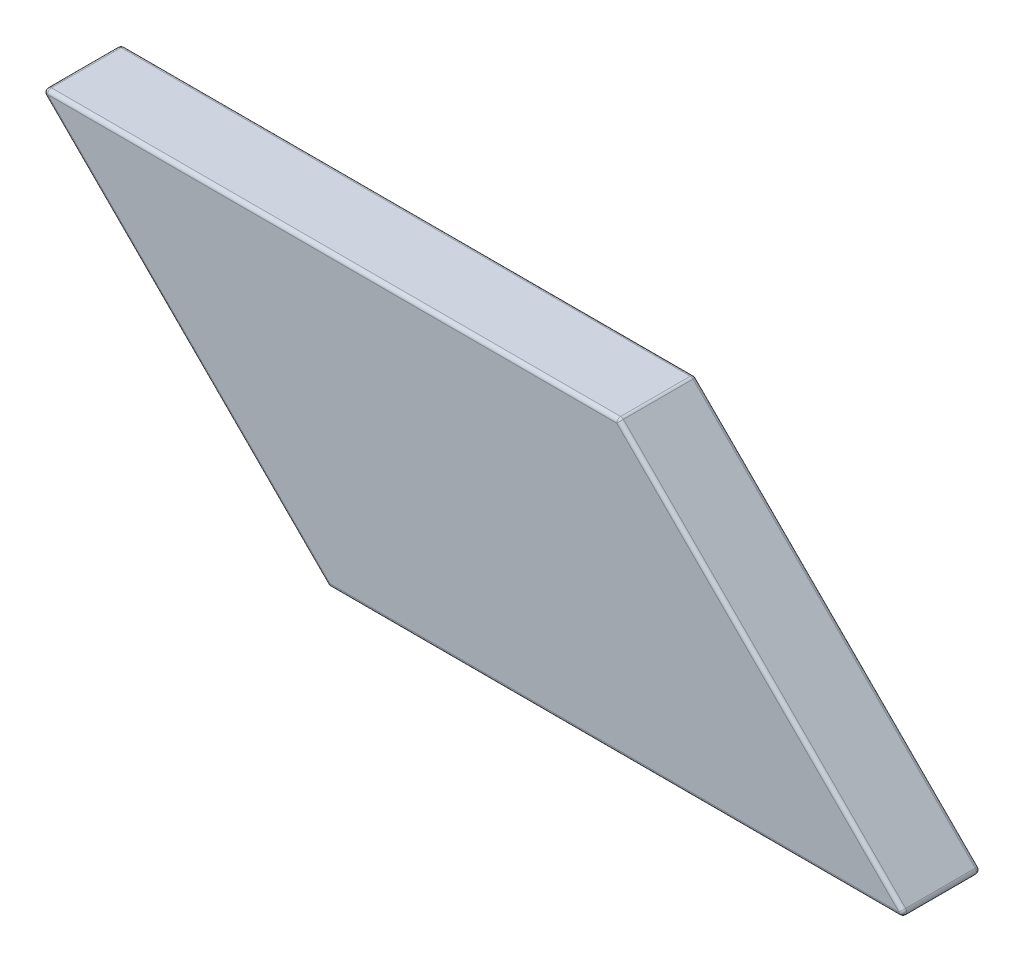
ISO-10303-21;
HEADER;
FILE_DESCRIPTION(('STEP AP214'),'2;1');
FILE_NAME('part.step','',(''),(''),'','','');
FILE_SCHEMA(('AUTOMOTIVE_DESIGN { 1 0 10303 214 1 1 1 1 }'));
ENDSEC;
DATA;
#1=APPLICATION_CONTEXT('core data for automotive mechanical design processes');
#2=APPLICATION_PROTOCOL_DEFINITION('international standard','automotive_design',2000,#1);
#3=PRODUCT_CONTEXT('',#1,'mechanical');
#4=PRODUCT('Part','Part','',(#3));
#5=PRODUCT_RELATED_PRODUCT_CATEGORY('part','',(#4));
#6=PRODUCT_DEFINITION_FORMATION('','',#4);
#7=PRODUCT_DEFINITION_CONTEXT('part definition',#1,'design');
#8=PRODUCT_DEFINITION('design','',#6,#7);
#9=PRODUCT_DEFINITION_SHAPE('','',#8);
#10=(LENGTH_UNIT() NAMED_UNIT(*) SI_UNIT(.MILLI.,.METRE.));
#11=(NAMED_UNIT(*) PLANE_ANGLE_UNIT() SI_UNIT($,.RADIAN.));
#12=(NAMED_UNIT(*) SI_UNIT($,.STERADIAN.) SOLID_ANGLE_UNIT());
#13=UNCERTAINTY_MEASURE_WITH_UNIT(LENGTH_MEASURE(1.E-05),#10,'distance_accuracy_value','');
#14=(GEOMETRIC_REPRESENTATION_CONTEXT(3) GLOBAL_UNCERTAINTY_ASSIGNED_CONTEXT((#13)) GLOBAL_UNIT_ASSIGNED_CONTEXT((#10,
#11,#12)) REPRESENTATION_CONTEXT('',''));
#15=CARTESIAN_POINT('',(0.,0.,0.));
#16=DIRECTION('',(0.,0.,1.));
#17=DIRECTION('',(1.,0.,0.));
#18=AXIS2_PLACEMENT_3D('',#15,#16,#17);
#19=CARTESIAN_POINT('',(0.,0.,10.));
#20=DIRECTION('',(0.,1.,0.));
#21=DIRECTION('',(0.,0.,1.));
#22=AXIS2_PLACEMENT_3D('',#19,#20,#21);
#23=PLANE('',#22);
#24=DIRECTION('',(1.,0.,0.));
#25=VECTOR('',#24,1.);
#26=CARTESIAN_POINT('',(0.,0.,9.5));
#27=LINE('',#26,#25);
#28=CARTESIAN_POINT('',(73.7928932188134,0.,9.5));
#29=VERTEX_POINT('',#28);
#30=CARTESIAN_POINT('',(0.207106781186547,0.,9.5));
#31=VERTEX_POINT('',#30);
#32=EDGE_CURVE('E178',#29,#31,#27,.F.);
#33=ORIENTED_EDGE('',*,*,#32,.T.);
#34=DIRECTION('',(0.,0.,-1.));
#35=VECTOR('',#34,1.);
#36=CARTESIAN_POINT('',(0.207106781186547,0.,10.));
#37=LINE('',#36,#35);
#38=CARTESIAN_POINT('',(0.207106781186547,0.,0.5));
#39=VERTEX_POINT('',#38);
#40=EDGE_CURVE('E182',#31,#39,#37,.T.);
#41=ORIENTED_EDGE('',*,*,#40,.T.);
#42=DIRECTION('',(1.,0.,0.));
#43=VECTOR('',#42,1.);
#44=CARTESIAN_POINT('',(75.,0.,0.5));
#45=LINE('',#44,#43);
#46=CARTESIAN_POINT('',(73.7928932188134,0.,0.5));
#47=VERTEX_POINT('',#46);
#48=EDGE_CURVE('E180',#39,#47,#45,.T.);
#49=ORIENTED_EDGE('',*,*,#48,.T.);
#50=DIRECTION('',(0.,0.,-1.));
#51=VECTOR('',#50,1.);
#52=CARTESIAN_POINT('',(73.7928932188134,0.,10.));
#53=LINE('',#52,#51);
#54=EDGE_CURVE('E176',#47,#29,#53,.F.);
#55=ORIENTED_EDGE('',*,*,#54,.T.);
#56=EDGE_LOOP('',(#33,#41,#49,#55));
#57=FACE_BOUND('',#56,.T.);
#58=ADVANCED_FACE('F33',(#57),#23,.F.);
#59=CARTESIAN_POINT('',(37.5,37.5,10.));
#60=DIRECTION('',(-0.707106781186547,-0.707106781186548,0.));
#61=DIRECTION('',(0.707106781186548,-0.707106781186547,0.));
#62=AXIS2_PLACEMENT_3D('',#59,#60,#61);
#63=PLANE('',#62);
#64=DIRECTION('',(-0.707106781186548,0.707106781186547,0.));
#65=VECTOR('',#64,1.);
#66=CARTESIAN_POINT('',(37.5,37.5,0.5));
#67=LINE('',#66,#65);
#68=CARTESIAN_POINT('',(74.1464466094067,0.853553390593271,0.5));
#69=VERTEX_POINT('',#68);
#70=CARTESIAN_POINT('',(37.6464466094067,37.3535533905933,0.5));
#71=VERTEX_POINT('',#70);
#72=EDGE_CURVE('E189',#69,#71,#67,.T.);
#73=ORIENTED_EDGE('',*,*,#72,.T.);
#74=DIRECTION('',(0.,0.,-1.));
#75=VECTOR('',#74,1.);
#76=CARTESIAN_POINT('',(37.6464466094067,37.3535533905933,10.));
#77=LINE('',#76,#75);
#78=CARTESIAN_POINT('',(37.6464466094067,37.3535533905933,9.5));
#79=VERTEX_POINT('',#78);
#80=EDGE_CURVE('E192',#71,#79,#77,.F.);
#81=ORIENTED_EDGE('',*,*,#80,.T.);
#82=DIRECTION('',(-0.707106781186548,0.707106781186547,0.));
#83=VECTOR('',#82,1.);
#84=CARTESIAN_POINT('',(37.5,37.5,9.5));
#85=LINE('',#84,#83);
#86=CARTESIAN_POINT('',(74.1464466094067,0.853553390593271,9.5));
#87=VERTEX_POINT('',#86);
#88=EDGE_CURVE('E187',#79,#87,#85,.F.);
#89=ORIENTED_EDGE('',*,*,#88,.T.);
#90=DIRECTION('',(0.,0.,-1.));
#91=VECTOR('',#90,1.);
#92=CARTESIAN_POINT('',(74.1464466094067,0.853553390593273,10.));
#93=LINE('',#92,#91);
#94=EDGE_CURVE('E185',#87,#69,#93,.T.);
#95=ORIENTED_EDGE('',*,*,#94,.T.);
#96=EDGE_LOOP('',(#73,#81,#89,#95));
#97=FACE_BOUND('',#96,.T.);
#98=ADVANCED_FACE('F278',(#97),#63,.F.);
#99=CARTESIAN_POINT('',(-37.5,37.5,10.));
#100=DIRECTION('',(0.,-1.,0.));
#101=DIRECTION('',(0.,0.,-1.));
#102=AXIS2_PLACEMENT_3D('',#99,#100,#101);
#103=PLANE('',#102);
#104=DIRECTION('',(-1.,0.,0.));
#105=VECTOR('',#104,1.);
#106=CARTESIAN_POINT('',(-37.5,37.5,0.5));
#107=LINE('',#106,#105);
#108=CARTESIAN_POINT('',(37.2928932188134,37.5,0.5));
#109=VERTEX_POINT('',#108);
#110=CARTESIAN_POINT('',(-36.2928932188135,37.5,0.5));
#111=VERTEX_POINT('',#110);
#112=EDGE_CURVE('E198',#109,#111,#107,.T.);
#113=ORIENTED_EDGE('',*,*,#112,.T.);
#114=DIRECTION('',(0.,0.,-1.));
#115=VECTOR('',#114,1.);
#116=CARTESIAN_POINT('',(-36.2928932188135,37.5,10.));
#117=LINE('',#116,#115);
#118=CARTESIAN_POINT('',(-36.2928932188135,37.5,9.5));
#119=VERTEX_POINT('',#118);
#120=EDGE_CURVE('E201',#111,#119,#117,.F.);
#121=ORIENTED_EDGE('',*,*,#120,.T.);
#122=DIRECTION('',(-1.,0.,0.));
#123=VECTOR('',#122,1.);
#124=CARTESIAN_POINT('',(-37.5,37.5,9.5));
#125=LINE('',#124,#123);
#126=CARTESIAN_POINT('',(37.2928932188134,37.5,9.5));
#127=VERTEX_POINT('',#126);
#128=EDGE_CURVE('E196',#119,#127,#125,.F.);
#129=ORIENTED_EDGE('',*,*,#128,.T.);
#130=DIRECTION('',(0.,0.,-1.));
#131=VECTOR('',#130,1.);
#132=CARTESIAN_POINT('',(37.2928932188134,37.5,10.));
#133=LINE('',#132,#131);
#134=EDGE_CURVE('E194',#127,#109,#133,.T.);
#135=ORIENTED_EDGE('',*,*,#134,.T.);
#136=EDGE_LOOP('',(#113,#121,#129,#135));
#137=FACE_BOUND('',#136,.T.);
#138=ADVANCED_FACE('F300',(#137),#103,.F.);
#139=CARTESIAN_POINT('',(0.,0.,10.));
#140=DIRECTION('',(0.707106781186547,0.707106781186548,0.));
#141=DIRECTION('',(-0.707106781186548,0.707106781186547,0.));
#142=AXIS2_PLACEMENT_3D('',#139,#140,#141);
#143=PLANE('',#142);
#144=DIRECTION('',(0.,0.,-1.));
#145=VECTOR('',#144,1.);
#146=CARTESIAN_POINT('',(-36.6464466094067,36.6464466094067,10.));
#147=LINE('',#146,#145);
#148=CARTESIAN_POINT('',(-36.6464466094067,36.6464466094067,9.5));
#149=VERTEX_POINT('',#148);
#150=CARTESIAN_POINT('',(-36.6464466094067,36.6464466094067,0.5));
#151=VERTEX_POINT('',#150);
#152=EDGE_CURVE('E129',#149,#151,#147,.T.);
#153=ORIENTED_EDGE('',*,*,#152,.T.);
#154=DIRECTION('',(0.707106781186548,-0.707106781186547,0.));
#155=VECTOR('',#154,1.);
#156=CARTESIAN_POINT('',(0.,0.,0.5));
#157=LINE('',#156,#155);
#158=CARTESIAN_POINT('',(-0.146446609406726,0.146446609406726,0.5));
#159=VERTEX_POINT('',#158);
#160=EDGE_CURVE('E165',#151,#159,#157,.T.);
#161=ORIENTED_EDGE('',*,*,#160,.T.);
#162=DIRECTION('',(0.,0.,-1.));
#163=VECTOR('',#162,1.);
#164=CARTESIAN_POINT('',(-0.146446609406726,0.146446609406726,10.));
#165=LINE('',#164,#163);
#166=CARTESIAN_POINT('',(-0.146446609406726,0.146446609406726,9.5));
#167=VERTEX_POINT('',#166);
#168=EDGE_CURVE('E132',#159,#167,#165,.F.);
#169=ORIENTED_EDGE('',*,*,#168,.T.);
#170=DIRECTION('',(0.707106781186548,-0.707106781186547,0.));
#171=VECTOR('',#170,1.);
#172=CARTESIAN_POINT('',(0.,0.,9.5));
#173=LINE('',#172,#171);
#174=EDGE_CURVE('E124',#167,#149,#173,.F.);
#175=ORIENTED_EDGE('',*,*,#174,.T.);
#176=EDGE_LOOP('',(#153,#161,#169,#175));
#177=FACE_BOUND('',#176,.T.);
#178=ADVANCED_FACE('F126',(#177),#143,.F.);
#179=CARTESIAN_POINT('',(0.,0.,10.));
#180=DIRECTION('',(0.,0.,-1.));
#181=DIRECTION('',(-1.,0.,0.));
#182=AXIS2_PLACEMENT_3D('',#179,#180,#181);
#183=PLANE('',#182);
#184=DIRECTION('',(0.707106781186548,-0.707106781186547,0.));
#185=VECTOR('',#184,1.);
#186=CARTESIAN_POINT('',(0.353553390593274,0.353553390593274,10.));
#187=LINE('',#186,#185);
#188=CARTESIAN_POINT('',(-36.2928932188135,37.,10.));
#189=VERTEX_POINT('',#188);
#190=CARTESIAN_POINT('',(0.207106781186547,0.5,10.));
#191=VERTEX_POINT('',#190);
#192=EDGE_CURVE('E142',#189,#191,#187,.T.);
#193=ORIENTED_EDGE('',*,*,#192,.T.);
#194=DIRECTION('',(1.,0.,0.));
#195=VECTOR('',#194,1.);
#196=CARTESIAN_POINT('',(0.,0.5,10.));
#197=LINE('',#196,#195);
#198=CARTESIAN_POINT('',(73.7928932188134,0.5,10.));
#199=VERTEX_POINT('',#198);
#200=EDGE_CURVE('E11',#191,#199,#197,.T.);
#201=ORIENTED_EDGE('',*,*,#200,.T.);
#202=DIRECTION('',(-0.707106781186548,0.707106781186547,0.));
#203=VECTOR('',#202,1.);
#204=CARTESIAN_POINT('',(37.1464466094067,37.1464466094067,10.));
#205=LINE('',#204,#203);
#206=CARTESIAN_POINT('',(37.2928932188134,37.,10.));
#207=VERTEX_POINT('',#206);
#208=EDGE_CURVE('E42',#199,#207,#205,.T.);
#209=ORIENTED_EDGE('',*,*,#208,.T.);
#210=DIRECTION('',(-1.,0.,0.));
#211=VECTOR('',#210,1.);
#212=CARTESIAN_POINT('',(0.,37.,10.));
#213=LINE('',#212,#211);
#214=EDGE_CURVE('E204',#207,#189,#213,.T.);
#215=ORIENTED_EDGE('',*,*,#214,.T.);
#216=EDGE_LOOP('',(#193,#201,#209,#215));
#217=FACE_BOUND('',#216,.T.);
#218=ADVANCED_FACE('F260',(#217),#183,.F.);
#219=CARTESIAN_POINT('',(0.,0.,0.));
#220=DIRECTION('',(0.,0.,-1.));
#221=DIRECTION('',(-1.,0.,0.));
#222=AXIS2_PLACEMENT_3D('',#219,#220,#221);
#223=PLANE('',#222);
#224=DIRECTION('',(1.,0.,0.));
#225=VECTOR('',#224,1.);
#226=CARTESIAN_POINT('',(0.,0.5,0.));
#227=LINE('',#226,#225);
#228=CARTESIAN_POINT('',(73.7928932188134,0.5,0.));
#229=VERTEX_POINT('',#228);
#230=CARTESIAN_POINT('',(0.207106781186552,0.5,0.));
#231=VERTEX_POINT('',#230);
#232=EDGE_CURVE('E171',#229,#231,#227,.F.);
#233=ORIENTED_EDGE('',*,*,#232,.T.);
#234=DIRECTION('',(0.707106781186548,-0.707106781186547,0.));
#235=VECTOR('',#234,1.);
#236=CARTESIAN_POINT('',(-37.1464466094067,37.8535533905933,0.));
#237=LINE('',#236,#235);
#238=CARTESIAN_POINT('',(-36.2928932188135,37.,0.));
#239=VERTEX_POINT('',#238);
#240=EDGE_CURVE('E173',#231,#239,#237,.F.);
#241=ORIENTED_EDGE('',*,*,#240,.T.);
#242=DIRECTION('',(-1.,0.,0.));
#243=VECTOR('',#242,1.);
#244=CARTESIAN_POINT('',(37.5,37.,0.));
#245=LINE('',#244,#243);
#246=CARTESIAN_POINT('',(37.2928932188134,37.,0.));
#247=VERTEX_POINT('',#246);
#248=EDGE_CURVE('E167',#239,#247,#245,.F.);
#249=ORIENTED_EDGE('',*,*,#248,.T.);
#250=DIRECTION('',(-0.707106781186548,0.707106781186547,0.));
#251=VECTOR('',#250,1.);
#252=CARTESIAN_POINT('',(74.6464466094067,-0.353553390593273,0.));
#253=LINE('',#252,#251);
#254=EDGE_CURVE('E169',#247,#229,#253,.F.);
#255=ORIENTED_EDGE('',*,*,#254,.T.);
#256=EDGE_LOOP('',(#233,#241,#249,#255));
#257=FACE_BOUND('',#256,.T.);
#258=ADVANCED_FACE('F475',(#257),#223,.T.);
#259=CARTESIAN_POINT('',(37.1464466094067,37.1464466094067,9.5));
#260=DIRECTION('',(-0.707106781186548,0.707106781186547,0.));
#261=DIRECTION('',(-0.707106781186547,-0.707106781186548,0.));
#262=AXIS2_PLACEMENT_3D('',#259,#260,#261);
#263=CYLINDRICAL_SURFACE('',#262,0.5);
#264=CARTESIAN_POINT('',(37.2928932188134,37.,9.5));
#265=DIRECTION('',(-0.707106781186547,0.707106781186547,0.));
#266=DIRECTION('',(-0.707106781186548,-0.707106781186548,0.));
#267=AXIS2_PLACEMENT_3D('',#264,#265,#266);
#268=CIRCLE('',#267,0.5);
#269=EDGE_CURVE('E37',#207,#79,#268,.T.);
#270=ORIENTED_EDGE('',*,*,#269,.F.);
#271=ORIENTED_EDGE('',*,*,#208,.F.);
#272=CARTESIAN_POINT('',(73.7928932188134,0.499999999999997,9.5));
#273=DIRECTION('',(0.707106781186549,-0.707106781186546,0.));
#274=DIRECTION('',(0.707106781186546,0.707106781186549,0.));
#275=AXIS2_PLACEMENT_3D('',#272,#273,#274);
#276=CIRCLE('',#275,0.5);
#277=EDGE_CURVE('E162',#87,#199,#276,.T.);
#278=ORIENTED_EDGE('',*,*,#277,.F.);
#279=ORIENTED_EDGE('',*,*,#88,.F.);
#280=EDGE_LOOP('',(#270,#271,#278,#279));
#281=FACE_BOUND('',#280,.T.);
#282=ADVANCED_FACE('F35',(#281),#263,.T.);
#283=CARTESIAN_POINT('',(37.2928932188134,37.,9.5));
#284=DIRECTION('',(0.,0.,1.));
#285=DIRECTION('',(1.,0.,0.));
#286=AXIS2_PLACEMENT_3D('',#283,#284,#285);
#287=SPHERICAL_SURFACE('',#286,0.5);
#288=CARTESIAN_POINT('',(37.2928932188134,37.,9.5));
#289=DIRECTION('',(1.,0.,0.));
#290=DIRECTION('',(0.,0.,-1.));
#291=AXIS2_PLACEMENT_3D('',#288,#289,#290);
#292=CIRCLE('',#291,0.5);
#293=EDGE_CURVE('E247',#207,#127,#292,.F.);
#294=ORIENTED_EDGE('',*,*,#293,.F.);
#295=ORIENTED_EDGE('',*,*,#269,.T.);
#296=CARTESIAN_POINT('',(37.2928932188134,37.,9.5));
#297=DIRECTION('',(0.,0.,1.));
#298=DIRECTION('',(1.,0.,0.));
#299=AXIS2_PLACEMENT_3D('',#296,#297,#298);
#300=CIRCLE('',#299,0.5);
#301=EDGE_CURVE('E250',#127,#79,#300,.F.);
#302=ORIENTED_EDGE('',*,*,#301,.F.);
#303=EDGE_LOOP('',(#294,#295,#302));
#304=FACE_BOUND('',#303,.T.);
#305=ADVANCED_FACE('F294',(#304),#287,.T.);
#306=CARTESIAN_POINT('',(73.7928932188134,0.5,9.5));
#307=DIRECTION('',(0.,0.,1.));
#308=DIRECTION('',(1.,0.,0.));
#309=AXIS2_PLACEMENT_3D('',#306,#307,#308);
#310=SPHERICAL_SURFACE('',#309,0.5);
#311=CARTESIAN_POINT('',(73.7928932188134,0.5,9.5));
#312=DIRECTION('',(0.,0.,1.));
#313=DIRECTION('',(1.,0.,0.));
#314=AXIS2_PLACEMENT_3D('',#311,#312,#313);
#315=CIRCLE('',#314,0.5);
#316=EDGE_CURVE('E243',#87,#29,#315,.F.);
#317=ORIENTED_EDGE('',*,*,#316,.F.);
#318=ORIENTED_EDGE('',*,*,#277,.T.);
#319=CARTESIAN_POINT('',(73.7928932188134,0.5,9.5));
#320=DIRECTION('',(1.,0.,0.));
#321=DIRECTION('',(0.,0.,-1.));
#322=AXIS2_PLACEMENT_3D('',#319,#320,#321);
#323=CIRCLE('',#322,0.5);
#324=EDGE_CURVE('E50',#29,#199,#323,.F.);
#325=ORIENTED_EDGE('',*,*,#324,.F.);
#326=EDGE_LOOP('',(#317,#318,#325));
#327=FACE_BOUND('',#326,.T.);
#328=ADVANCED_FACE('F255',(#327),#310,.T.);
#329=CARTESIAN_POINT('',(37.2928932188134,37.,10.));
#330=DIRECTION('',(0.,0.,-1.));
#331=DIRECTION('',(-1.,0.,0.));
#332=AXIS2_PLACEMENT_3D('',#329,#330,#331);
#333=CYLINDRICAL_SURFACE('',#332,0.5);
#334=ORIENTED_EDGE('',*,*,#301,.T.);
#335=ORIENTED_EDGE('',*,*,#80,.F.);
#336=CARTESIAN_POINT('',(37.2928932188134,37.,0.5));
#337=DIRECTION('',(0.,0.,-1.));
#338=DIRECTION('',(-1.,0.,0.));
#339=AXIS2_PLACEMENT_3D('',#336,#337,#338);
#340=CIRCLE('',#339,0.5);
#341=EDGE_CURVE('E238',#109,#71,#340,.T.);
#342=ORIENTED_EDGE('',*,*,#341,.F.);
#343=ORIENTED_EDGE('',*,*,#134,.F.);
#344=EDGE_LOOP('',(#334,#335,#342,#343));
#345=FACE_BOUND('',#344,.T.);
#346=ADVANCED_FACE('F290',(#345),#333,.T.);
#347=CARTESIAN_POINT('',(0.,37.,9.5));
#348=DIRECTION('',(-1.,0.,0.));
#349=DIRECTION('',(0.,0.,1.));
#350=AXIS2_PLACEMENT_3D('',#347,#348,#349);
#351=CYLINDRICAL_SURFACE('',#350,0.5);
#352=ORIENTED_EDGE('',*,*,#293,.T.);
#353=ORIENTED_EDGE('',*,*,#128,.F.);
#354=CARTESIAN_POINT('',(-36.2928932188135,37.,9.5));
#355=DIRECTION('',(-1.,0.,0.));
#356=DIRECTION('',(0.,0.,1.));
#357=AXIS2_PLACEMENT_3D('',#354,#355,#356);
#358=CIRCLE('',#357,0.5);
#359=EDGE_CURVE('E146',#189,#119,#358,.T.);
#360=ORIENTED_EDGE('',*,*,#359,.F.);
#361=ORIENTED_EDGE('',*,*,#214,.F.);
#362=EDGE_LOOP('',(#352,#353,#360,#361));
#363=FACE_BOUND('',#362,.T.);
#364=ADVANCED_FACE('F298',(#363),#351,.T.);
#365=CARTESIAN_POINT('',(0.353553390593274,0.353553390593274,9.5));
#366=DIRECTION('',(0.707106781186548,-0.707106781186547,0.));
#367=DIRECTION('',(0.707106781186547,0.707106781186548,0.));
#368=AXIS2_PLACEMENT_3D('',#365,#366,#367);
#369=CYLINDRICAL_SURFACE('',#368,0.5);
#370=CARTESIAN_POINT('',(0.207106781186547,0.5,9.5));
#371=DIRECTION('',(0.707106781186548,-0.707106781186547,0.));
#372=DIRECTION('',(0.707106781186547,0.707106781186548,0.));
#373=AXIS2_PLACEMENT_3D('',#370,#371,#372);
#374=CIRCLE('',#373,0.5);
#375=EDGE_CURVE('E147',#191,#167,#374,.T.);
#376=ORIENTED_EDGE('',*,*,#375,.F.);
#377=ORIENTED_EDGE('',*,*,#192,.F.);
#378=CARTESIAN_POINT('',(-36.2928932188135,37.,9.5));
#379=DIRECTION('',(-0.707106781186547,0.707106781186547,0.));
#380=DIRECTION('',(-0.707106781186548,-0.707106781186548,0.));
#381=AXIS2_PLACEMENT_3D('',#378,#379,#380);
#382=CIRCLE('',#381,0.5);
#383=EDGE_CURVE('E139',#149,#189,#382,.T.);
#384=ORIENTED_EDGE('',*,*,#383,.F.);
#385=ORIENTED_EDGE('',*,*,#174,.F.);
#386=EDGE_LOOP('',(#376,#377,#384,#385));
#387=FACE_BOUND('',#386,.T.);
#388=ADVANCED_FACE('F141',(#387),#369,.T.);
#389=CARTESIAN_POINT('',(0.,0.5,9.5));
#390=DIRECTION('',(1.,0.,0.));
#391=DIRECTION('',(0.,0.,-1.));
#392=AXIS2_PLACEMENT_3D('',#389,#390,#391);
#393=CYLINDRICAL_SURFACE('',#392,0.5);
#394=ORIENTED_EDGE('',*,*,#324,.T.);
#395=ORIENTED_EDGE('',*,*,#200,.F.);
#396=CARTESIAN_POINT('',(0.207106781186547,0.5,9.5));
#397=DIRECTION('',(-1.,0.,0.));
#398=DIRECTION('',(0.,0.,1.));
#399=AXIS2_PLACEMENT_3D('',#396,#397,#398);
#400=CIRCLE('',#399,0.5);
#401=EDGE_CURVE('E233',#31,#191,#400,.T.);
#402=ORIENTED_EDGE('',*,*,#401,.F.);
#403=ORIENTED_EDGE('',*,*,#32,.F.);
#404=EDGE_LOOP('',(#394,#395,#402,#403));
#405=FACE_BOUND('',#404,.T.);
#406=ADVANCED_FACE('F262',(#405),#393,.T.);
#407=CARTESIAN_POINT('',(73.7928932188134,0.5,10.));
#408=DIRECTION('',(0.,0.,-1.));
#409=DIRECTION('',(-1.,0.,0.));
#410=AXIS2_PLACEMENT_3D('',#407,#408,#409);
#411=CYLINDRICAL_SURFACE('',#410,0.5);
#412=ORIENTED_EDGE('',*,*,#316,.T.);
#413=ORIENTED_EDGE('',*,*,#54,.F.);
#414=CARTESIAN_POINT('',(73.7928932188134,0.499999999999997,0.5));
#415=DIRECTION('',(0.,0.,-1.));
#416=DIRECTION('',(-1.,0.,0.));
#417=AXIS2_PLACEMENT_3D('',#414,#415,#416);
#418=CIRCLE('',#417,0.5);
#419=EDGE_CURVE('E230',#69,#47,#418,.T.);
#420=ORIENTED_EDGE('',*,*,#419,.F.);
#421=ORIENTED_EDGE('',*,*,#94,.F.);
#422=EDGE_LOOP('',(#412,#413,#420,#421));
#423=FACE_BOUND('',#422,.T.);
#424=ADVANCED_FACE('F275',(#423),#411,.T.);
#425=CARTESIAN_POINT('',(37.1464466094067,37.1464466094067,0.5));
#426=DIRECTION('',(0.707106781186548,-0.707106781186547,0.));
#427=DIRECTION('',(0.707106781186547,0.707106781186548,0.));
#428=AXIS2_PLACEMENT_3D('',#425,#426,#427);
#429=CYLINDRICAL_SURFACE('',#428,0.5);
#430=CARTESIAN_POINT('',(37.2928932188134,37.,0.5));
#431=DIRECTION('',(-0.707106781186547,0.707106781186547,0.));
#432=DIRECTION('',(-0.707106781186548,-0.707106781186548,0.));
#433=AXIS2_PLACEMENT_3D('',#430,#431,#432);
#434=CIRCLE('',#433,0.5);
#435=EDGE_CURVE('E240',#71,#247,#434,.T.);
#436=ORIENTED_EDGE('',*,*,#435,.F.);
#437=ORIENTED_EDGE('',*,*,#72,.F.);
#438=CARTESIAN_POINT('',(73.7928932188134,0.5,0.5));
#439=DIRECTION('',(0.707106781186546,-0.707106781186549,0.));
#440=DIRECTION('',(0.707106781186549,0.707106781186546,0.));
#441=AXIS2_PLACEMENT_3D('',#438,#439,#440);
#442=CIRCLE('',#441,0.5);
#443=EDGE_CURVE('E227',#229,#69,#442,.T.);
#444=ORIENTED_EDGE('',*,*,#443,.F.);
#445=ORIENTED_EDGE('',*,*,#254,.F.);
#446=EDGE_LOOP('',(#436,#437,#444,#445));
#447=FACE_BOUND('',#446,.T.);
#448=ADVANCED_FACE('F282',(#447),#429,.T.);
#449=CARTESIAN_POINT('',(37.2928932188134,37.,0.5));
#450=DIRECTION('',(0.,0.,1.));
#451=DIRECTION('',(1.,0.,0.));
#452=AXIS2_PLACEMENT_3D('',#449,#450,#451);
#453=SPHERICAL_SURFACE('',#452,0.5);
#454=ORIENTED_EDGE('',*,*,#341,.T.);
#455=ORIENTED_EDGE('',*,*,#435,.T.);
#456=CARTESIAN_POINT('',(37.2928932188134,37.,0.5));
#457=DIRECTION('',(1.,0.,0.));
#458=DIRECTION('',(0.,0.,-1.));
#459=AXIS2_PLACEMENT_3D('',#456,#457,#458);
#460=CIRCLE('',#459,0.5);
#461=EDGE_CURVE('E154',#109,#247,#460,.F.);
#462=ORIENTED_EDGE('',*,*,#461,.F.);
#463=EDGE_LOOP('',(#454,#455,#462));
#464=FACE_BOUND('',#463,.T.);
#465=ADVANCED_FACE('F405',(#464),#453,.T.);
#466=CARTESIAN_POINT('',(-36.2928932188135,37.,9.5));
#467=DIRECTION('',(0.,0.,1.));
#468=DIRECTION('',(1.,0.,0.));
#469=AXIS2_PLACEMENT_3D('',#466,#467,#468);
#470=SPHERICAL_SURFACE('',#469,0.5);
#471=ORIENTED_EDGE('',*,*,#383,.T.);
#472=ORIENTED_EDGE('',*,*,#359,.T.);
#473=CARTESIAN_POINT('',(-36.2928932188135,37.,9.5));
#474=DIRECTION('',(0.,0.,1.));
#475=DIRECTION('',(1.,0.,0.));
#476=AXIS2_PLACEMENT_3D('',#473,#474,#475);
#477=CIRCLE('',#476,0.5);
#478=EDGE_CURVE('E150',#149,#119,#477,.F.);
#479=ORIENTED_EDGE('',*,*,#478,.F.);
#480=EDGE_LOOP('',(#471,#472,#479));
#481=FACE_BOUND('',#480,.T.);
#482=ADVANCED_FACE('F151',(#481),#470,.T.);
#483=CARTESIAN_POINT('',(0.207106781186547,0.5,9.5));
#484=DIRECTION('',(0.,0.,1.));
#485=DIRECTION('',(1.,0.,0.));
#486=AXIS2_PLACEMENT_3D('',#483,#484,#485);
#487=SPHERICAL_SURFACE('',#486,0.5);
#488=ORIENTED_EDGE('',*,*,#401,.T.);
#489=ORIENTED_EDGE('',*,*,#375,.T.);
#490=CARTESIAN_POINT('',(0.207106781186547,0.5,9.5));
#491=DIRECTION('',(0.,0.,1.));
#492=DIRECTION('',(1.,0.,0.));
#493=AXIS2_PLACEMENT_3D('',#490,#491,#492);
#494=CIRCLE('',#493,0.5);
#495=EDGE_CURVE('E155',#31,#167,#494,.F.);
#496=ORIENTED_EDGE('',*,*,#495,.F.);
#497=EDGE_LOOP('',(#488,#489,#496));
#498=FACE_BOUND('',#497,.T.);
#499=ADVANCED_FACE('F265',(#498),#487,.T.);
#500=CARTESIAN_POINT('',(73.7928932188134,0.5,0.5));
#501=DIRECTION('',(0.,0.,1.));
#502=DIRECTION('',(1.,0.,0.));
#503=AXIS2_PLACEMENT_3D('',#500,#501,#502);
#504=SPHERICAL_SURFACE('',#503,0.5);
#505=ORIENTED_EDGE('',*,*,#443,.T.);
#506=ORIENTED_EDGE('',*,*,#419,.T.);
#507=CARTESIAN_POINT('',(73.7928932188134,0.5,0.5));
#508=DIRECTION('',(1.,0.,0.));
#509=DIRECTION('',(0.,0.,-1.));
#510=AXIS2_PLACEMENT_3D('',#507,#508,#509);
#511=CIRCLE('',#510,0.5);
#512=EDGE_CURVE('E220',#229,#47,#511,.F.);
#513=ORIENTED_EDGE('',*,*,#512,.F.);
#514=EDGE_LOOP('',(#505,#506,#513));
#515=FACE_BOUND('',#514,.T.);
#516=ADVANCED_FACE('F320',(#515),#504,.T.);
#517=CARTESIAN_POINT('',(-37.5,37.,0.5));
#518=DIRECTION('',(1.,0.,0.));
#519=DIRECTION('',(0.,0.,-1.));
#520=AXIS2_PLACEMENT_3D('',#517,#518,#519);
#521=CYLINDRICAL_SURFACE('',#520,0.5);
#522=ORIENTED_EDGE('',*,*,#461,.T.);
#523=ORIENTED_EDGE('',*,*,#248,.F.);
#524=CARTESIAN_POINT('',(-36.2928932188135,37.,0.5));
#525=DIRECTION('',(-1.,0.,0.));
#526=DIRECTION('',(0.,0.,1.));
#527=AXIS2_PLACEMENT_3D('',#524,#525,#526);
#528=CIRCLE('',#527,0.5);
#529=EDGE_CURVE('E217',#111,#239,#528,.T.);
#530=ORIENTED_EDGE('',*,*,#529,.F.);
#531=ORIENTED_EDGE('',*,*,#112,.F.);
#532=EDGE_LOOP('',(#522,#523,#530,#531));
#533=FACE_BOUND('',#532,.T.);
#534=ADVANCED_FACE('F304',(#533),#521,.T.);
#535=CARTESIAN_POINT('',(-36.2928932188135,37.,10.));
#536=DIRECTION('',(0.,0.,-1.));
#537=DIRECTION('',(-1.,0.,0.));
#538=AXIS2_PLACEMENT_3D('',#535,#536,#537);
#539=CYLINDRICAL_SURFACE('',#538,0.5);
#540=ORIENTED_EDGE('',*,*,#478,.T.);
#541=ORIENTED_EDGE('',*,*,#120,.F.);
#542=CARTESIAN_POINT('',(-36.2928932188135,37.,0.5));
#543=DIRECTION('',(0.,0.,-1.));
#544=DIRECTION('',(-1.,0.,0.));
#545=AXIS2_PLACEMENT_3D('',#542,#543,#544);
#546=CIRCLE('',#545,0.5);
#547=EDGE_CURVE('E158',#151,#111,#546,.T.);
#548=ORIENTED_EDGE('',*,*,#547,.F.);
#549=ORIENTED_EDGE('',*,*,#152,.F.);
#550=EDGE_LOOP('',(#540,#541,#548,#549));
#551=FACE_BOUND('',#550,.T.);
#552=ADVANCED_FACE('F157',(#551),#539,.T.);
#553=CARTESIAN_POINT('',(0.207106781186547,0.5,10.));
#554=DIRECTION('',(0.,0.,-1.));
#555=DIRECTION('',(-1.,0.,0.));
#556=AXIS2_PLACEMENT_3D('',#553,#554,#555);
#557=CYLINDRICAL_SURFACE('',#556,0.5);
#558=ORIENTED_EDGE('',*,*,#495,.T.);
#559=ORIENTED_EDGE('',*,*,#168,.F.);
#560=CARTESIAN_POINT('',(0.207106781186547,0.5,0.5));
#561=DIRECTION('',(0.,0.,-1.));
#562=DIRECTION('',(-1.,0.,0.));
#563=AXIS2_PLACEMENT_3D('',#560,#561,#562);
#564=CIRCLE('',#563,0.5);
#565=EDGE_CURVE('E213',#39,#159,#564,.T.);
#566=ORIENTED_EDGE('',*,*,#565,.F.);
#567=ORIENTED_EDGE('',*,*,#40,.F.);
#568=EDGE_LOOP('',(#558,#559,#566,#567));
#569=FACE_BOUND('',#568,.T.);
#570=ADVANCED_FACE('F269',(#569),#557,.T.);
#571=CARTESIAN_POINT('',(0.,0.5,0.5));
#572=DIRECTION('',(-1.,0.,0.));
#573=DIRECTION('',(0.,0.,1.));
#574=AXIS2_PLACEMENT_3D('',#571,#572,#573);
#575=CYLINDRICAL_SURFACE('',#574,0.5);
#576=ORIENTED_EDGE('',*,*,#512,.T.);
#577=ORIENTED_EDGE('',*,*,#48,.F.);
#578=CARTESIAN_POINT('',(0.207106781186552,0.5,0.5));
#579=DIRECTION('',(-1.,0.,0.));
#580=DIRECTION('',(0.,-1.,0.));
#581=AXIS2_PLACEMENT_3D('',#578,#579,#580);
#582=CIRCLE('',#581,0.5);
#583=EDGE_CURVE('E211',#231,#39,#582,.T.);
#584=ORIENTED_EDGE('',*,*,#583,.F.);
#585=ORIENTED_EDGE('',*,*,#232,.F.);
#586=EDGE_LOOP('',(#576,#577,#584,#585));
#587=FACE_BOUND('',#586,.T.);
#588=ADVANCED_FACE('F318',(#587),#575,.T.);
#589=CARTESIAN_POINT('',(-36.2928932188135,37.,0.5));
#590=DIRECTION('',(0.,0.,1.));
#591=DIRECTION('',(1.,0.,0.));
#592=AXIS2_PLACEMENT_3D('',#589,#590,#591);
#593=SPHERICAL_SURFACE('',#592,0.5);
#594=ORIENTED_EDGE('',*,*,#547,.T.);
#595=ORIENTED_EDGE('',*,*,#529,.T.);
#596=CARTESIAN_POINT('',(-36.2928932188135,37.,0.5));
#597=DIRECTION('',(-0.707106781186548,0.707106781186548,0.));
#598=DIRECTION('',(-0.707106781186548,-0.707106781186548,0.));
#599=AXIS2_PLACEMENT_3D('',#596,#597,#598);
#600=CIRCLE('',#599,0.5);
#601=EDGE_CURVE('E209',#151,#239,#600,.F.);
#602=ORIENTED_EDGE('',*,*,#601,.F.);
#603=EDGE_LOOP('',(#594,#595,#602));
#604=FACE_BOUND('',#603,.T.);
#605=ADVANCED_FACE('F307',(#604),#593,.T.);
#606=CARTESIAN_POINT('',(0.207106781186547,0.5,0.5));
#607=DIRECTION('',(0.,0.,1.));
#608=DIRECTION('',(1.,0.,0.));
#609=AXIS2_PLACEMENT_3D('',#606,#607,#608);
#610=SPHERICAL_SURFACE('',#609,0.5);
#611=ORIENTED_EDGE('',*,*,#583,.T.);
#612=ORIENTED_EDGE('',*,*,#565,.T.);
#613=CARTESIAN_POINT('',(0.207106781186547,0.5,0.5));
#614=DIRECTION('',(0.707106781186548,-0.707106781186547,0.));
#615=DIRECTION('',(0.707106781186547,0.707106781186548,0.));
#616=AXIS2_PLACEMENT_3D('',#613,#614,#615);
#617=CIRCLE('',#616,0.5);
#618=EDGE_CURVE('E207',#231,#159,#617,.F.);
#619=ORIENTED_EDGE('',*,*,#618,.F.);
#620=EDGE_LOOP('',(#611,#612,#619));
#621=FACE_BOUND('',#620,.T.);
#622=ADVANCED_FACE('F314',(#621),#610,.T.);
#623=CARTESIAN_POINT('',(0.353553390593274,0.353553390593274,0.5));
#624=DIRECTION('',(-0.707106781186548,0.707106781186547,0.));
#625=DIRECTION('',(-0.707106781186547,-0.707106781186548,0.));
#626=AXIS2_PLACEMENT_3D('',#623,#624,#625);
#627=CYLINDRICAL_SURFACE('',#626,0.5);
#628=ORIENTED_EDGE('',*,*,#601,.T.);
#629=ORIENTED_EDGE('',*,*,#240,.F.);
#630=ORIENTED_EDGE('',*,*,#618,.T.);
#631=ORIENTED_EDGE('',*,*,#160,.F.);
#632=EDGE_LOOP('',(#628,#629,#630,#631));
#633=FACE_BOUND('',#632,.T.);
#634=ADVANCED_FACE('F311',(#633),#627,.T.);
#635=CLOSED_SHELL('',(#58,#98,#138,#178,#218,#258,#282,#305,#328,#346,#364,#388,#406,#424,#448,
#465,#482,#499,#516,#534,#552,#570,#588,#605,#622,#634));
#636=MANIFOLD_SOLID_BREP('B2',#635);
#637=ADVANCED_BREP_SHAPE_REPRESENTATION('',(#18,#636),#14);
#638=SHAPE_DEFINITION_REPRESENTATION(#9,#637);
ENDSEC;
END-ISO-10303-21;
